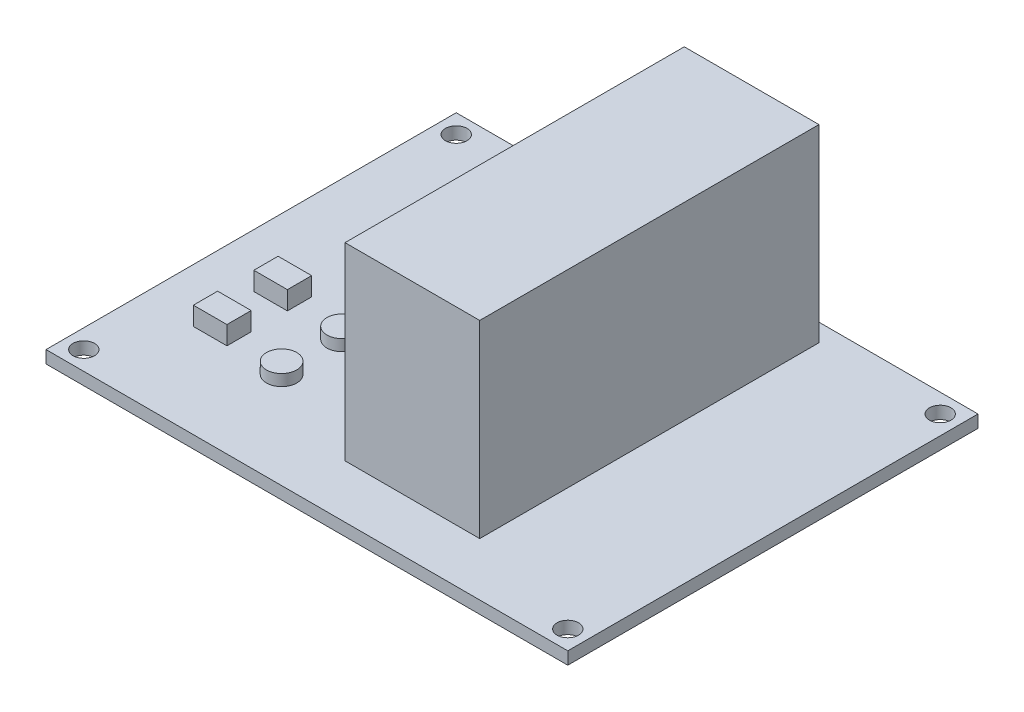
ISO-10303-21;
HEADER;
FILE_DESCRIPTION(('STEP AP214'),'2;1');
FILE_NAME('part.step','',(''),(''),'','','');
FILE_SCHEMA(('AUTOMOTIVE_DESIGN { 1 0 10303 214 1 1 1 1 }'));
ENDSEC;
DATA;
#1=APPLICATION_CONTEXT('core data for automotive mechanical design processes');
#2=APPLICATION_PROTOCOL_DEFINITION('international standard','automotive_design',2000,#1);
#3=PRODUCT_CONTEXT('',#1,'mechanical');
#4=PRODUCT('Part','Part','',(#3));
#5=PRODUCT_RELATED_PRODUCT_CATEGORY('part','',(#4));
#6=PRODUCT_DEFINITION_FORMATION('','',#4);
#7=PRODUCT_DEFINITION_CONTEXT('part definition',#1,'design');
#8=PRODUCT_DEFINITION('design','',#6,#7);
#9=PRODUCT_DEFINITION_SHAPE('','',#8);
#10=(LENGTH_UNIT() NAMED_UNIT(*) SI_UNIT(.MILLI.,.METRE.));
#11=(NAMED_UNIT(*) PLANE_ANGLE_UNIT() SI_UNIT($,.RADIAN.));
#12=(NAMED_UNIT(*) SI_UNIT($,.STERADIAN.) SOLID_ANGLE_UNIT());
#13=UNCERTAINTY_MEASURE_WITH_UNIT(LENGTH_MEASURE(1.E-05),#10,'distance_accuracy_value','');
#14=(GEOMETRIC_REPRESENTATION_CONTEXT(3) GLOBAL_UNCERTAINTY_ASSIGNED_CONTEXT((#13)) GLOBAL_UNIT_ASSIGNED_CONTEXT((#10,
#11,#12)) REPRESENTATION_CONTEXT('',''));
#15=CARTESIAN_POINT('',(0.,0.,0.));
#16=DIRECTION('',(0.,0.,1.));
#17=DIRECTION('',(1.,0.,0.));
#18=AXIS2_PLACEMENT_3D('',#15,#16,#17);
#19=CARTESIAN_POINT('',(0.,1.65,0.));
#20=DIRECTION('',(0.,-1.,0.));
#21=DIRECTION('',(0.,0.,-1.));
#22=AXIS2_PLACEMENT_3D('',#19,#20,#21);
#23=PLANE('',#22);
#24=CARTESIAN_POINT('',(-32.015,1.65,-24.635));
#25=DIRECTION('',(0.,1.,0.));
#26=DIRECTION('',(0.,0.,1.));
#27=AXIS2_PLACEMENT_3D('',#24,#25,#26);
#28=CIRCLE('',#27,1.42239999999999);
#29=CARTESIAN_POINT('',(-32.015,1.65,-23.2126));
#30=VERTEX_POINT('',#29);
#31=EDGE_CURVE('E319',#30,#30,#28,.T.);
#32=ORIENTED_EDGE('',*,*,#31,.F.);
#33=EDGE_LOOP('',(#32));
#34=FACE_BOUND('',#33,.T.);
#35=CARTESIAN_POINT('',(-32.015,1.65,24.635));
#36=DIRECTION('',(0.,1.,0.));
#37=DIRECTION('',(0.,0.,1.));
#38=AXIS2_PLACEMENT_3D('',#35,#36,#37);
#39=CIRCLE('',#38,1.42239999999999);
#40=CARTESIAN_POINT('',(-32.015,1.65,26.0574));
#41=VERTEX_POINT('',#40);
#42=EDGE_CURVE('E313',#41,#41,#39,.T.);
#43=ORIENTED_EDGE('',*,*,#42,.F.);
#44=EDGE_LOOP('',(#43));
#45=FACE_BOUND('',#44,.T.);
#46=CARTESIAN_POINT('',(32.015,1.65,24.635));
#47=DIRECTION('',(0.,1.,0.));
#48=DIRECTION('',(0.,0.,1.));
#49=AXIS2_PLACEMENT_3D('',#46,#47,#48);
#50=CIRCLE('',#49,1.42239999999999);
#51=CARTESIAN_POINT('',(32.015,1.65,26.0574));
#52=VERTEX_POINT('',#51);
#53=EDGE_CURVE('E307',#52,#52,#50,.T.);
#54=ORIENTED_EDGE('',*,*,#53,.F.);
#55=EDGE_LOOP('',(#54));
#56=FACE_BOUND('',#55,.T.);
#57=CARTESIAN_POINT('',(32.015,1.65,-24.635));
#58=DIRECTION('',(0.,1.,0.));
#59=DIRECTION('',(0.,0.,1.));
#60=AXIS2_PLACEMENT_3D('',#57,#58,#59);
#61=CIRCLE('',#60,1.42239999999999);
#62=CARTESIAN_POINT('',(32.015,1.65,-23.2126));
#63=VERTEX_POINT('',#62);
#64=EDGE_CURVE('E301',#63,#63,#61,.T.);
#65=ORIENTED_EDGE('',*,*,#64,.F.);
#66=EDGE_LOOP('',(#65));
#67=FACE_BOUND('',#66,.T.);
#68=DIRECTION('',(0.,0.,-1.));
#69=VECTOR('',#68,1.);
#70=CARTESIAN_POINT('',(-22.975,1.65,3.53));
#71=LINE('',#70,#69);
#72=CARTESIAN_POINT('',(-22.975,1.65,6.74));
#73=VERTEX_POINT('',#72);
#74=CARTESIAN_POINT('',(-22.975,1.65,3.53));
#75=VERTEX_POINT('',#74);
#76=EDGE_CURVE('E167',#73,#75,#71,.T.);
#77=ORIENTED_EDGE('',*,*,#76,.F.);
#78=DIRECTION('',(1.,0.,0.));
#79=VECTOR('',#78,1.);
#80=CARTESIAN_POINT('',(-27.415,1.65,6.74));
#81=LINE('',#80,#79);
#82=CARTESIAN_POINT('',(-27.415,1.65,6.74));
#83=VERTEX_POINT('',#82);
#84=EDGE_CURVE('E180',#83,#73,#81,.T.);
#85=ORIENTED_EDGE('',*,*,#84,.F.);
#86=DIRECTION('',(0.,0.,1.));
#87=VECTOR('',#86,1.);
#88=CARTESIAN_POINT('',(-27.415,1.65,3.53));
#89=LINE('',#88,#87);
#90=CARTESIAN_POINT('',(-27.415,1.65,3.53));
#91=VERTEX_POINT('',#90);
#92=EDGE_CURVE('E189',#91,#83,#89,.T.);
#93=ORIENTED_EDGE('',*,*,#92,.F.);
#94=DIRECTION('',(-1.,0.,0.));
#95=VECTOR('',#94,1.);
#96=CARTESIAN_POINT('',(-27.415,1.65,3.53));
#97=LINE('',#96,#95);
#98=EDGE_CURVE('E170',#75,#91,#97,.T.);
#99=ORIENTED_EDGE('',*,*,#98,.F.);
#100=EDGE_LOOP('',(#77,#85,#93,#99));
#101=FACE_BOUND('',#100,.T.);
#102=DIRECTION('',(0.,0.,-1.));
#103=VECTOR('',#102,1.);
#104=CARTESIAN_POINT('',(34.515,1.65,27.135));
#105=LINE('',#104,#103);
#106=CARTESIAN_POINT('',(34.515,1.65,27.135));
#107=VERTEX_POINT('',#106);
#108=CARTESIAN_POINT('',(34.515,1.65,-27.135));
#109=VERTEX_POINT('',#108);
#110=EDGE_CURVE('E245',#107,#109,#105,.T.);
#111=ORIENTED_EDGE('',*,*,#110,.T.);
#112=DIRECTION('',(-1.,0.,0.));
#113=VECTOR('',#112,1.);
#114=CARTESIAN_POINT('',(-34.515,1.65,-27.135));
#115=LINE('',#114,#113);
#116=CARTESIAN_POINT('',(-34.515,1.65,-27.135));
#117=VERTEX_POINT('',#116);
#118=EDGE_CURVE('E248',#109,#117,#115,.T.);
#119=ORIENTED_EDGE('',*,*,#118,.T.);
#120=DIRECTION('',(0.,0.,1.));
#121=VECTOR('',#120,1.);
#122=CARTESIAN_POINT('',(-34.515,1.65,27.135));
#123=LINE('',#122,#121);
#124=CARTESIAN_POINT('',(-34.515,1.65,27.135));
#125=VERTEX_POINT('',#124);
#126=EDGE_CURVE('E251',#117,#125,#123,.T.);
#127=ORIENTED_EDGE('',*,*,#126,.T.);
#128=DIRECTION('',(1.,0.,0.));
#129=VECTOR('',#128,1.);
#130=CARTESIAN_POINT('',(-34.515,1.65,27.135));
#131=LINE('',#130,#129);
#132=EDGE_CURVE('E253',#125,#107,#131,.T.);
#133=ORIENTED_EDGE('',*,*,#132,.T.);
#134=EDGE_LOOP('',(#111,#119,#127,#133));
#135=FACE_BOUND('',#134,.T.);
#136=CARTESIAN_POINT('',(-16.095,1.65,14.385));
#137=DIRECTION('',(0.,-1.,0.));
#138=DIRECTION('',(0.,0.,-1.));
#139=AXIS2_PLACEMENT_3D('',#136,#137,#138);
#140=CIRCLE('',#139,2.);
#141=CARTESIAN_POINT('',(-16.095,1.65,12.385));
#142=VERTEX_POINT('',#141);
#143=EDGE_CURVE('E41',#142,#142,#140,.F.);
#144=ORIENTED_EDGE('',*,*,#143,.F.);
#145=EDGE_LOOP('',(#144));
#146=FACE_BOUND('',#145,.T.);
#147=CARTESIAN_POINT('',(-16.095,1.65,6.385));
#148=DIRECTION('',(0.,-1.,0.));
#149=DIRECTION('',(0.,0.,-1.));
#150=AXIS2_PLACEMENT_3D('',#147,#148,#149);
#151=CIRCLE('',#150,2.);
#152=CARTESIAN_POINT('',(-16.095,1.65,4.385));
#153=VERTEX_POINT('',#152);
#154=EDGE_CURVE('E11',#153,#153,#151,.F.);
#155=ORIENTED_EDGE('',*,*,#154,.F.);
#156=EDGE_LOOP('',(#155));
#157=FACE_BOUND('',#156,.T.);
#158=DIRECTION('',(0.,0.,-1.));
#159=VECTOR('',#158,1.);
#160=CARTESIAN_POINT('',(-22.975,1.65,11.53));
#161=LINE('',#160,#159);
#162=CARTESIAN_POINT('',(-22.975,1.65,14.74));
#163=VERTEX_POINT('',#162);
#164=CARTESIAN_POINT('',(-22.975,1.65,11.53));
#165=VERTEX_POINT('',#164);
#166=EDGE_CURVE('E205',#163,#165,#161,.T.);
#167=ORIENTED_EDGE('',*,*,#166,.F.);
#168=DIRECTION('',(1.,0.,0.));
#169=VECTOR('',#168,1.);
#170=CARTESIAN_POINT('',(-27.415,1.65,14.74));
#171=LINE('',#170,#169);
#172=CARTESIAN_POINT('',(-27.415,1.65,14.74));
#173=VERTEX_POINT('',#172);
#174=EDGE_CURVE('E210',#173,#163,#171,.T.);
#175=ORIENTED_EDGE('',*,*,#174,.F.);
#176=DIRECTION('',(0.,0.,1.));
#177=VECTOR('',#176,1.);
#178=CARTESIAN_POINT('',(-27.415,1.65,11.53));
#179=LINE('',#178,#177);
#180=CARTESIAN_POINT('',(-27.415,1.65,11.53));
#181=VERTEX_POINT('',#180);
#182=EDGE_CURVE('E222',#181,#173,#179,.T.);
#183=ORIENTED_EDGE('',*,*,#182,.F.);
#184=DIRECTION('',(-1.,0.,0.));
#185=VECTOR('',#184,1.);
#186=CARTESIAN_POINT('',(-27.415,1.65,11.53));
#187=LINE('',#186,#185);
#188=EDGE_CURVE('E219',#165,#181,#187,.T.);
#189=ORIENTED_EDGE('',*,*,#188,.F.);
#190=EDGE_LOOP('',(#167,#175,#183,#189));
#191=FACE_BOUND('',#190,.T.);
#192=DIRECTION('',(0.,0.,1.));
#193=VECTOR('',#192,1.);
#194=CARTESIAN_POINT('',(-1.98499999999999,1.65,-24.775));
#195=LINE('',#194,#193);
#196=CARTESIAN_POINT('',(-1.98499999999999,1.65,-24.775));
#197=VERTEX_POINT('',#196);
#198=CARTESIAN_POINT('',(-1.98499999999999,1.65,20.105));
#199=VERTEX_POINT('',#198);
#200=EDGE_CURVE('E166',#197,#199,#195,.T.);
#201=ORIENTED_EDGE('',*,*,#200,.F.);
#202=DIRECTION('',(-1.,0.,0.));
#203=VECTOR('',#202,1.);
#204=CARTESIAN_POINT('',(-1.98499999999999,1.65,-24.775));
#205=LINE('',#204,#203);
#206=CARTESIAN_POINT('',(15.835,1.65,-24.775));
#207=VERTEX_POINT('',#206);
#208=EDGE_CURVE('E163',#207,#197,#205,.T.);
#209=ORIENTED_EDGE('',*,*,#208,.F.);
#210=DIRECTION('',(0.,0.,-1.));
#211=VECTOR('',#210,1.);
#212=CARTESIAN_POINT('',(15.835,1.65,-24.775));
#213=LINE('',#212,#211);
#214=CARTESIAN_POINT('',(15.835,1.65,20.105));
#215=VERTEX_POINT('',#214);
#216=EDGE_CURVE('E53',#215,#207,#213,.T.);
#217=ORIENTED_EDGE('',*,*,#216,.F.);
#218=DIRECTION('',(1.,0.,0.));
#219=VECTOR('',#218,1.);
#220=CARTESIAN_POINT('',(-1.98499999999999,1.65,20.105));
#221=LINE('',#220,#219);
#222=EDGE_CURVE('E48',#199,#215,#221,.T.);
#223=ORIENTED_EDGE('',*,*,#222,.F.);
#224=EDGE_LOOP('',(#201,#209,#217,#223));
#225=FACE_BOUND('',#224,.T.);
#226=ADVANCED_FACE('F33',(#34,#45,#56,#67,#101,#135,#146,#157,#191,#225),#23,.F.);
#227=CARTESIAN_POINT('',(34.515,1.65,27.135));
#228=DIRECTION('',(-1.,0.,0.));
#229=DIRECTION('',(0.,0.,1.));
#230=AXIS2_PLACEMENT_3D('',#227,#228,#229);
#231=PLANE('',#230);
#232=DIRECTION('',(0.,0.,-1.));
#233=VECTOR('',#232,1.);
#234=CARTESIAN_POINT('',(34.515,0.,27.135));
#235=LINE('',#234,#233);
#236=CARTESIAN_POINT('',(34.515,0.,27.135));
#237=VERTEX_POINT('',#236);
#238=CARTESIAN_POINT('',(34.515,0.,-27.135));
#239=VERTEX_POINT('',#238);
#240=EDGE_CURVE('E244',#237,#239,#235,.T.);
#241=ORIENTED_EDGE('',*,*,#240,.T.);
#242=DIRECTION('',(0.,-1.,0.));
#243=VECTOR('',#242,1.);
#244=CARTESIAN_POINT('',(34.515,1.65,-27.135));
#245=LINE('',#244,#243);
#246=EDGE_CURVE('E271',#109,#239,#245,.T.);
#247=ORIENTED_EDGE('',*,*,#246,.F.);
#248=ORIENTED_EDGE('',*,*,#110,.F.);
#249=DIRECTION('',(0.,-1.,0.));
#250=VECTOR('',#249,1.);
#251=CARTESIAN_POINT('',(34.515,1.65,27.135));
#252=LINE('',#251,#250);
#253=EDGE_CURVE('E255',#107,#237,#252,.T.);
#254=ORIENTED_EDGE('',*,*,#253,.T.);
#255=EDGE_LOOP('',(#241,#247,#248,#254));
#256=FACE_BOUND('',#255,.T.);
#257=ADVANCED_FACE('F35',(#256),#231,.F.);
#258=CARTESIAN_POINT('',(-34.515,1.65,-27.135));
#259=DIRECTION('',(0.,0.,1.));
#260=DIRECTION('',(1.,0.,0.));
#261=AXIS2_PLACEMENT_3D('',#258,#259,#260);
#262=PLANE('',#261);
#263=DIRECTION('',(-1.,0.,0.));
#264=VECTOR('',#263,1.);
#265=CARTESIAN_POINT('',(-34.515,0.,-27.135));
#266=LINE('',#265,#264);
#267=CARTESIAN_POINT('',(-34.515,0.,-27.135));
#268=VERTEX_POINT('',#267);
#269=EDGE_CURVE('E258',#239,#268,#266,.T.);
#270=ORIENTED_EDGE('',*,*,#269,.T.);
#271=DIRECTION('',(0.,-1.,0.));
#272=VECTOR('',#271,1.);
#273=CARTESIAN_POINT('',(-34.515,1.65,-27.135));
#274=LINE('',#273,#272);
#275=EDGE_CURVE('E268',#117,#268,#274,.T.);
#276=ORIENTED_EDGE('',*,*,#275,.F.);
#277=ORIENTED_EDGE('',*,*,#118,.F.);
#278=ORIENTED_EDGE('',*,*,#246,.T.);
#279=EDGE_LOOP('',(#270,#276,#277,#278));
#280=FACE_BOUND('',#279,.T.);
#281=ADVANCED_FACE('F340',(#280),#262,.F.);
#282=CARTESIAN_POINT('',(-34.515,1.65,27.135));
#283=DIRECTION('',(1.,0.,0.));
#284=DIRECTION('',(0.,0.,-1.));
#285=AXIS2_PLACEMENT_3D('',#282,#283,#284);
#286=PLANE('',#285);
#287=DIRECTION('',(0.,0.,1.));
#288=VECTOR('',#287,1.);
#289=CARTESIAN_POINT('',(-34.515,0.,27.135));
#290=LINE('',#289,#288);
#291=CARTESIAN_POINT('',(-34.515,0.,27.135));
#292=VERTEX_POINT('',#291);
#293=EDGE_CURVE('E260',#268,#292,#290,.T.);
#294=ORIENTED_EDGE('',*,*,#293,.T.);
#295=DIRECTION('',(0.,-1.,0.));
#296=VECTOR('',#295,1.);
#297=CARTESIAN_POINT('',(-34.515,1.65,27.135));
#298=LINE('',#297,#296);
#299=EDGE_CURVE('E265',#125,#292,#298,.T.);
#300=ORIENTED_EDGE('',*,*,#299,.F.);
#301=ORIENTED_EDGE('',*,*,#126,.F.);
#302=ORIENTED_EDGE('',*,*,#275,.T.);
#303=EDGE_LOOP('',(#294,#300,#301,#302));
#304=FACE_BOUND('',#303,.T.);
#305=ADVANCED_FACE('F345',(#304),#286,.F.);
#306=CARTESIAN_POINT('',(-34.515,1.65,27.135));
#307=DIRECTION('',(0.,0.,-1.));
#308=DIRECTION('',(-1.,0.,0.));
#309=AXIS2_PLACEMENT_3D('',#306,#307,#308);
#310=PLANE('',#309);
#311=DIRECTION('',(1.,0.,0.));
#312=VECTOR('',#311,1.);
#313=CARTESIAN_POINT('',(-34.515,0.,27.135));
#314=LINE('',#313,#312);
#315=EDGE_CURVE('E249',#292,#237,#314,.T.);
#316=ORIENTED_EDGE('',*,*,#315,.T.);
#317=ORIENTED_EDGE('',*,*,#253,.F.);
#318=ORIENTED_EDGE('',*,*,#132,.F.);
#319=ORIENTED_EDGE('',*,*,#299,.T.);
#320=EDGE_LOOP('',(#316,#317,#318,#319));
#321=FACE_BOUND('',#320,.T.);
#322=ADVANCED_FACE('F348',(#321),#310,.F.);
#323=CARTESIAN_POINT('',(0.,0.,0.));
#324=DIRECTION('',(0.,-1.,0.));
#325=DIRECTION('',(0.,0.,-1.));
#326=AXIS2_PLACEMENT_3D('',#323,#324,#325);
#327=PLANE('',#326);
#328=CARTESIAN_POINT('',(-32.015,0.,-24.635));
#329=DIRECTION('',(0.,1.,0.));
#330=DIRECTION('',(0.,0.,1.));
#331=AXIS2_PLACEMENT_3D('',#328,#329,#330);
#332=CIRCLE('',#331,1.42239999999999);
#333=CARTESIAN_POINT('',(-32.015,0.,-23.2126));
#334=VERTEX_POINT('',#333);
#335=EDGE_CURVE('E316',#334,#334,#332,.T.);
#336=ORIENTED_EDGE('',*,*,#335,.T.);
#337=EDGE_LOOP('',(#336));
#338=FACE_BOUND('',#337,.T.);
#339=CARTESIAN_POINT('',(-32.015,0.,24.635));
#340=DIRECTION('',(0.,1.,0.));
#341=DIRECTION('',(0.,0.,1.));
#342=AXIS2_PLACEMENT_3D('',#339,#340,#341);
#343=CIRCLE('',#342,1.42239999999999);
#344=CARTESIAN_POINT('',(-32.015,0.,26.0574));
#345=VERTEX_POINT('',#344);
#346=EDGE_CURVE('E310',#345,#345,#343,.T.);
#347=ORIENTED_EDGE('',*,*,#346,.T.);
#348=EDGE_LOOP('',(#347));
#349=FACE_BOUND('',#348,.T.);
#350=CARTESIAN_POINT('',(32.015,0.,24.635));
#351=DIRECTION('',(0.,1.,0.));
#352=DIRECTION('',(0.,0.,1.));
#353=AXIS2_PLACEMENT_3D('',#350,#351,#352);
#354=CIRCLE('',#353,1.42239999999999);
#355=CARTESIAN_POINT('',(32.015,0.,26.0574));
#356=VERTEX_POINT('',#355);
#357=EDGE_CURVE('E304',#356,#356,#354,.T.);
#358=ORIENTED_EDGE('',*,*,#357,.T.);
#359=EDGE_LOOP('',(#358));
#360=FACE_BOUND('',#359,.T.);
#361=CARTESIAN_POINT('',(32.015,0.,-24.635));
#362=DIRECTION('',(0.,1.,0.));
#363=DIRECTION('',(0.,0.,1.));
#364=AXIS2_PLACEMENT_3D('',#361,#362,#363);
#365=CIRCLE('',#364,1.42239999999999);
#366=CARTESIAN_POINT('',(32.015,0.,-23.2126));
#367=VERTEX_POINT('',#366);
#368=EDGE_CURVE('E285',#367,#367,#365,.T.);
#369=ORIENTED_EDGE('',*,*,#368,.T.);
#370=EDGE_LOOP('',(#369));
#371=FACE_BOUND('',#370,.T.);
#372=ORIENTED_EDGE('',*,*,#240,.F.);
#373=ORIENTED_EDGE('',*,*,#315,.F.);
#374=ORIENTED_EDGE('',*,*,#293,.F.);
#375=ORIENTED_EDGE('',*,*,#269,.F.);
#376=EDGE_LOOP('',(#372,#373,#374,#375));
#377=FACE_BOUND('',#376,.T.);
#378=ADVANCED_FACE('F350',(#338,#349,#360,#371,#377),#327,.T.);
#379=CARTESIAN_POINT('',(-16.095,3.15,14.385));
#380=DIRECTION('',(0.,-1.,0.));
#381=DIRECTION('',(0.,0.,-1.));
#382=AXIS2_PLACEMENT_3D('',#379,#380,#381);
#383=CYLINDRICAL_SURFACE('',#382,2.);
#384=CARTESIAN_POINT('',(-16.095,3.15,14.385));
#385=DIRECTION('',(0.,1.,0.));
#386=DIRECTION('',(0.,0.,1.));
#387=AXIS2_PLACEMENT_3D('',#384,#385,#386);
#388=CIRCLE('',#387,2.);
#389=CARTESIAN_POINT('',(-16.095,3.15,16.385));
#390=VERTEX_POINT('',#389);
#391=EDGE_CURVE('E241',#390,#390,#388,.T.);
#392=ORIENTED_EDGE('',*,*,#391,.F.);
#393=EDGE_LOOP('',(#392));
#394=FACE_BOUND('',#393,.T.);
#395=ORIENTED_EDGE('',*,*,#143,.T.);
#396=EDGE_LOOP('',(#395));
#397=FACE_BOUND('',#396,.T.);
#398=ADVANCED_FACE('F276',(#394,#397),#383,.T.);
#399=CARTESIAN_POINT('',(-16.095,3.15,14.385));
#400=DIRECTION('',(0.,1.,0.));
#401=DIRECTION('',(0.,0.,1.));
#402=AXIS2_PLACEMENT_3D('',#399,#400,#401);
#403=PLANE('',#402);
#404=ORIENTED_EDGE('',*,*,#391,.T.);
#405=EDGE_LOOP('',(#404));
#406=FACE_BOUND('',#405,.T.);
#407=ADVANCED_FACE('F358',(#406),#403,.T.);
#408=CARTESIAN_POINT('',(-16.095,3.15,6.385));
#409=DIRECTION('',(0.,-1.,0.));
#410=DIRECTION('',(0.,0.,-1.));
#411=AXIS2_PLACEMENT_3D('',#408,#409,#410);
#412=CYLINDRICAL_SURFACE('',#411,2.);
#413=CARTESIAN_POINT('',(-16.095,3.15,6.385));
#414=DIRECTION('',(0.,1.,0.));
#415=DIRECTION('',(0.,0.,1.));
#416=AXIS2_PLACEMENT_3D('',#413,#414,#415);
#417=CIRCLE('',#416,2.);
#418=CARTESIAN_POINT('',(-16.095,3.15,8.385));
#419=VERTEX_POINT('',#418);
#420=EDGE_CURVE('E238',#419,#419,#417,.T.);
#421=ORIENTED_EDGE('',*,*,#420,.F.);
#422=EDGE_LOOP('',(#421));
#423=FACE_BOUND('',#422,.T.);
#424=ORIENTED_EDGE('',*,*,#154,.T.);
#425=EDGE_LOOP('',(#424));
#426=FACE_BOUND('',#425,.T.);
#427=ADVANCED_FACE('F404',(#423,#426),#412,.T.);
#428=CARTESIAN_POINT('',(-16.095,3.15,6.385));
#429=DIRECTION('',(0.,1.,0.));
#430=DIRECTION('',(0.,0.,1.));
#431=AXIS2_PLACEMENT_3D('',#428,#429,#430);
#432=PLANE('',#431);
#433=ORIENTED_EDGE('',*,*,#420,.T.);
#434=EDGE_LOOP('',(#433));
#435=FACE_BOUND('',#434,.T.);
#436=ADVANCED_FACE('F414',(#435),#432,.T.);
#437=CARTESIAN_POINT('',(-22.975,4.09,11.53));
#438=DIRECTION('',(-1.,0.,0.));
#439=DIRECTION('',(0.,0.,1.));
#440=AXIS2_PLACEMENT_3D('',#437,#438,#439);
#441=PLANE('',#440);
#442=ORIENTED_EDGE('',*,*,#166,.T.);
#443=DIRECTION('',(0.,-1.,0.));
#444=VECTOR('',#443,1.);
#445=CARTESIAN_POINT('',(-22.975,4.09,11.53));
#446=LINE('',#445,#444);
#447=CARTESIAN_POINT('',(-22.975,4.09,11.53));
#448=VERTEX_POINT('',#447);
#449=EDGE_CURVE('E235',#448,#165,#446,.T.);
#450=ORIENTED_EDGE('',*,*,#449,.F.);
#451=DIRECTION('',(0.,0.,-1.));
#452=VECTOR('',#451,1.);
#453=CARTESIAN_POINT('',(-22.975,4.09,11.53));
#454=LINE('',#453,#452);
#455=CARTESIAN_POINT('',(-22.975,4.09,14.74));
#456=VERTEX_POINT('',#455);
#457=EDGE_CURVE('E206',#456,#448,#454,.T.);
#458=ORIENTED_EDGE('',*,*,#457,.F.);
#459=DIRECTION('',(0.,-1.,0.));
#460=VECTOR('',#459,1.);
#461=CARTESIAN_POINT('',(-22.975,4.09,14.74));
#462=LINE('',#461,#460);
#463=EDGE_CURVE('E216',#456,#163,#462,.T.);
#464=ORIENTED_EDGE('',*,*,#463,.T.);
#465=EDGE_LOOP('',(#442,#450,#458,#464));
#466=FACE_BOUND('',#465,.T.);
#467=ADVANCED_FACE('F424',(#466),#441,.F.);
#468=CARTESIAN_POINT('',(-27.415,4.09,11.53));
#469=DIRECTION('',(0.,0.,1.));
#470=DIRECTION('',(1.,0.,0.));
#471=AXIS2_PLACEMENT_3D('',#468,#469,#470);
#472=PLANE('',#471);
#473=ORIENTED_EDGE('',*,*,#188,.T.);
#474=DIRECTION('',(0.,-1.,0.));
#475=VECTOR('',#474,1.);
#476=CARTESIAN_POINT('',(-27.415,4.09,11.53));
#477=LINE('',#476,#475);
#478=CARTESIAN_POINT('',(-27.415,4.09,11.53));
#479=VERTEX_POINT('',#478);
#480=EDGE_CURVE('E232',#479,#181,#477,.T.);
#481=ORIENTED_EDGE('',*,*,#480,.F.);
#482=DIRECTION('',(-1.,0.,0.));
#483=VECTOR('',#482,1.);
#484=CARTESIAN_POINT('',(-27.415,4.09,11.53));
#485=LINE('',#484,#483);
#486=EDGE_CURVE('E209',#448,#479,#485,.T.);
#487=ORIENTED_EDGE('',*,*,#486,.F.);
#488=ORIENTED_EDGE('',*,*,#449,.T.);
#489=EDGE_LOOP('',(#473,#481,#487,#488));
#490=FACE_BOUND('',#489,.T.);
#491=ADVANCED_FACE('F434',(#490),#472,.F.);
#492=CARTESIAN_POINT('',(-27.415,4.09,11.53));
#493=DIRECTION('',(1.,0.,0.));
#494=DIRECTION('',(0.,0.,-1.));
#495=AXIS2_PLACEMENT_3D('',#492,#493,#494);
#496=PLANE('',#495);
#497=ORIENTED_EDGE('',*,*,#182,.T.);
#498=DIRECTION('',(0.,-1.,0.));
#499=VECTOR('',#498,1.);
#500=CARTESIAN_POINT('',(-27.415,4.09,14.74));
#501=LINE('',#500,#499);
#502=CARTESIAN_POINT('',(-27.415,4.09,14.74));
#503=VERTEX_POINT('',#502);
#504=EDGE_CURVE('E229',#503,#173,#501,.T.);
#505=ORIENTED_EDGE('',*,*,#504,.F.);
#506=DIRECTION('',(0.,0.,1.));
#507=VECTOR('',#506,1.);
#508=CARTESIAN_POINT('',(-27.415,4.09,11.53));
#509=LINE('',#508,#507);
#510=EDGE_CURVE('E212',#479,#503,#509,.T.);
#511=ORIENTED_EDGE('',*,*,#510,.F.);
#512=ORIENTED_EDGE('',*,*,#480,.T.);
#513=EDGE_LOOP('',(#497,#505,#511,#512));
#514=FACE_BOUND('',#513,.T.);
#515=ADVANCED_FACE('F444',(#514),#496,.F.);
#516=CARTESIAN_POINT('',(-27.415,4.09,14.74));
#517=DIRECTION('',(0.,0.,-1.));
#518=DIRECTION('',(-1.,0.,0.));
#519=AXIS2_PLACEMENT_3D('',#516,#517,#518);
#520=PLANE('',#519);
#521=ORIENTED_EDGE('',*,*,#174,.T.);
#522=ORIENTED_EDGE('',*,*,#463,.F.);
#523=DIRECTION('',(1.,0.,0.));
#524=VECTOR('',#523,1.);
#525=CARTESIAN_POINT('',(-27.415,4.09,14.74));
#526=LINE('',#525,#524);
#527=EDGE_CURVE('E214',#503,#456,#526,.T.);
#528=ORIENTED_EDGE('',*,*,#527,.F.);
#529=ORIENTED_EDGE('',*,*,#504,.T.);
#530=EDGE_LOOP('',(#521,#522,#528,#529));
#531=FACE_BOUND('',#530,.T.);
#532=ADVANCED_FACE('F454',(#531),#520,.F.);
#533=CARTESIAN_POINT('',(0.,4.09,0.));
#534=DIRECTION('',(0.,1.,0.));
#535=DIRECTION('',(0.,0.,1.));
#536=AXIS2_PLACEMENT_3D('',#533,#534,#535);
#537=PLANE('',#536);
#538=ORIENTED_EDGE('',*,*,#457,.T.);
#539=ORIENTED_EDGE('',*,*,#486,.T.);
#540=ORIENTED_EDGE('',*,*,#510,.T.);
#541=ORIENTED_EDGE('',*,*,#527,.T.);
#542=EDGE_LOOP('',(#538,#539,#540,#541));
#543=FACE_BOUND('',#542,.T.);
#544=ADVANCED_FACE('F464',(#543),#537,.T.);
#545=CARTESIAN_POINT('',(-22.975,4.09,3.53));
#546=DIRECTION('',(-1.,0.,0.));
#547=DIRECTION('',(0.,0.,1.));
#548=AXIS2_PLACEMENT_3D('',#545,#546,#547);
#549=PLANE('',#548);
#550=ORIENTED_EDGE('',*,*,#76,.T.);
#551=DIRECTION('',(0.,-1.,0.));
#552=VECTOR('',#551,1.);
#553=CARTESIAN_POINT('',(-22.975,4.09,3.53));
#554=LINE('',#553,#552);
#555=CARTESIAN_POINT('',(-22.975,4.09,3.53));
#556=VERTEX_POINT('',#555);
#557=EDGE_CURVE('E202',#556,#75,#554,.T.);
#558=ORIENTED_EDGE('',*,*,#557,.F.);
#559=DIRECTION('',(0.,0.,-1.));
#560=VECTOR('',#559,1.);
#561=CARTESIAN_POINT('',(-22.975,4.09,3.53));
#562=LINE('',#561,#560);
#563=CARTESIAN_POINT('',(-22.975,4.09,6.74));
#564=VERTEX_POINT('',#563);
#565=EDGE_CURVE('E176',#564,#556,#562,.T.);
#566=ORIENTED_EDGE('',*,*,#565,.F.);
#567=DIRECTION('',(0.,-1.,0.));
#568=VECTOR('',#567,1.);
#569=CARTESIAN_POINT('',(-22.975,4.09,6.74));
#570=LINE('',#569,#568);
#571=EDGE_CURVE('E185',#564,#73,#570,.T.);
#572=ORIENTED_EDGE('',*,*,#571,.T.);
#573=EDGE_LOOP('',(#550,#558,#566,#572));
#574=FACE_BOUND('',#573,.T.);
#575=ADVANCED_FACE('F474',(#574),#549,.F.);
#576=CARTESIAN_POINT('',(-27.415,4.09,3.53));
#577=DIRECTION('',(0.,0.,1.));
#578=DIRECTION('',(1.,0.,0.));
#579=AXIS2_PLACEMENT_3D('',#576,#577,#578);
#580=PLANE('',#579);
#581=ORIENTED_EDGE('',*,*,#98,.T.);
#582=DIRECTION('',(0.,-1.,0.));
#583=VECTOR('',#582,1.);
#584=CARTESIAN_POINT('',(-27.415,4.09,3.53));
#585=LINE('',#584,#583);
#586=CARTESIAN_POINT('',(-27.415,4.09,3.53));
#587=VERTEX_POINT('',#586);
#588=EDGE_CURVE('E199',#587,#91,#585,.T.);
#589=ORIENTED_EDGE('',*,*,#588,.F.);
#590=DIRECTION('',(-1.,0.,0.));
#591=VECTOR('',#590,1.);
#592=CARTESIAN_POINT('',(-27.415,4.09,3.53));
#593=LINE('',#592,#591);
#594=EDGE_CURVE('E179',#556,#587,#593,.T.);
#595=ORIENTED_EDGE('',*,*,#594,.F.);
#596=ORIENTED_EDGE('',*,*,#557,.T.);
#597=EDGE_LOOP('',(#581,#589,#595,#596));
#598=FACE_BOUND('',#597,.T.);
#599=ADVANCED_FACE('F484',(#598),#580,.F.);
#600=CARTESIAN_POINT('',(-27.415,4.09,3.53));
#601=DIRECTION('',(1.,0.,0.));
#602=DIRECTION('',(0.,0.,-1.));
#603=AXIS2_PLACEMENT_3D('',#600,#601,#602);
#604=PLANE('',#603);
#605=ORIENTED_EDGE('',*,*,#92,.T.);
#606=DIRECTION('',(0.,-1.,0.));
#607=VECTOR('',#606,1.);
#608=CARTESIAN_POINT('',(-27.415,4.09,6.74));
#609=LINE('',#608,#607);
#610=CARTESIAN_POINT('',(-27.415,4.09,6.74));
#611=VERTEX_POINT('',#610);
#612=EDGE_CURVE('E196',#611,#83,#609,.T.);
#613=ORIENTED_EDGE('',*,*,#612,.F.);
#614=DIRECTION('',(0.,0.,1.));
#615=VECTOR('',#614,1.);
#616=CARTESIAN_POINT('',(-27.415,4.09,3.53));
#617=LINE('',#616,#615);
#618=EDGE_CURVE('E182',#587,#611,#617,.T.);
#619=ORIENTED_EDGE('',*,*,#618,.F.);
#620=ORIENTED_EDGE('',*,*,#588,.T.);
#621=EDGE_LOOP('',(#605,#613,#619,#620));
#622=FACE_BOUND('',#621,.T.);
#623=ADVANCED_FACE('F494',(#622),#604,.F.);
#624=CARTESIAN_POINT('',(-27.415,4.09,6.74));
#625=DIRECTION('',(0.,0.,-1.));
#626=DIRECTION('',(-1.,0.,0.));
#627=AXIS2_PLACEMENT_3D('',#624,#625,#626);
#628=PLANE('',#627);
#629=ORIENTED_EDGE('',*,*,#84,.T.);
#630=ORIENTED_EDGE('',*,*,#571,.F.);
#631=DIRECTION('',(1.,0.,0.));
#632=VECTOR('',#631,1.);
#633=CARTESIAN_POINT('',(-27.415,4.09,6.74));
#634=LINE('',#633,#632);
#635=EDGE_CURVE('E184',#611,#564,#634,.T.);
#636=ORIENTED_EDGE('',*,*,#635,.F.);
#637=ORIENTED_EDGE('',*,*,#612,.T.);
#638=EDGE_LOOP('',(#629,#630,#636,#637));
#639=FACE_BOUND('',#638,.T.);
#640=ADVANCED_FACE('F504',(#639),#628,.F.);
#641=CARTESIAN_POINT('',(0.,4.09,0.));
#642=DIRECTION('',(0.,1.,0.));
#643=DIRECTION('',(0.,0.,1.));
#644=AXIS2_PLACEMENT_3D('',#641,#642,#643);
#645=PLANE('',#644);
#646=ORIENTED_EDGE('',*,*,#565,.T.);
#647=ORIENTED_EDGE('',*,*,#594,.T.);
#648=ORIENTED_EDGE('',*,*,#618,.T.);
#649=ORIENTED_EDGE('',*,*,#635,.T.);
#650=EDGE_LOOP('',(#646,#647,#648,#649));
#651=FACE_BOUND('',#650,.T.);
#652=ADVANCED_FACE('F514',(#651),#645,.T.);
#653=CARTESIAN_POINT('',(-1.98499999999999,26.65,-24.775));
#654=DIRECTION('',(1.,0.,0.));
#655=DIRECTION('',(0.,0.,-1.));
#656=AXIS2_PLACEMENT_3D('',#653,#654,#655);
#657=PLANE('',#656);
#658=ORIENTED_EDGE('',*,*,#200,.T.);
#659=DIRECTION('',(0.,-1.,0.));
#660=VECTOR('',#659,1.);
#661=CARTESIAN_POINT('',(-1.98499999999999,26.65,20.105));
#662=LINE('',#661,#660);
#663=CARTESIAN_POINT('',(-1.98499999999999,26.65,20.105));
#664=VERTEX_POINT('',#663);
#665=EDGE_CURVE('E147',#664,#199,#662,.T.);
#666=ORIENTED_EDGE('',*,*,#665,.F.);
#667=DIRECTION('',(0.,0.,1.));
#668=VECTOR('',#667,1.);
#669=CARTESIAN_POINT('',(-1.98499999999999,26.65,-24.775));
#670=LINE('',#669,#668);
#671=CARTESIAN_POINT('',(-1.98499999999999,26.65,-24.775));
#672=VERTEX_POINT('',#671);
#673=EDGE_CURVE('E154',#672,#664,#670,.T.);
#674=ORIENTED_EDGE('',*,*,#673,.F.);
#675=DIRECTION('',(0.,-1.,0.));
#676=VECTOR('',#675,1.);
#677=CARTESIAN_POINT('',(-1.98499999999999,26.65,-24.775));
#678=LINE('',#677,#676);
#679=EDGE_CURVE('E290',#672,#197,#678,.T.);
#680=ORIENTED_EDGE('',*,*,#679,.T.);
#681=EDGE_LOOP('',(#658,#666,#674,#680));
#682=FACE_BOUND('',#681,.T.);
#683=ADVANCED_FACE('F165',(#682),#657,.F.);
#684=CARTESIAN_POINT('',(-1.98499999999999,26.65,20.105));
#685=DIRECTION('',(0.,0.,-1.));
#686=DIRECTION('',(-1.,0.,0.));
#687=AXIS2_PLACEMENT_3D('',#684,#685,#686);
#688=PLANE('',#687);
#689=ORIENTED_EDGE('',*,*,#222,.T.);
#690=DIRECTION('',(0.,-1.,0.));
#691=VECTOR('',#690,1.);
#692=CARTESIAN_POINT('',(15.835,26.65,20.105));
#693=LINE('',#692,#691);
#694=CARTESIAN_POINT('',(15.835,26.65,20.105));
#695=VERTEX_POINT('',#694);
#696=EDGE_CURVE('E150',#695,#215,#693,.T.);
#697=ORIENTED_EDGE('',*,*,#696,.F.);
#698=DIRECTION('',(1.,0.,0.));
#699=VECTOR('',#698,1.);
#700=CARTESIAN_POINT('',(-1.98499999999999,26.65,20.105));
#701=LINE('',#700,#699);
#702=EDGE_CURVE('E143',#664,#695,#701,.T.);
#703=ORIENTED_EDGE('',*,*,#702,.F.);
#704=ORIENTED_EDGE('',*,*,#665,.T.);
#705=EDGE_LOOP('',(#689,#697,#703,#704));
#706=FACE_BOUND('',#705,.T.);
#707=ADVANCED_FACE('F145',(#706),#688,.F.);
#708=CARTESIAN_POINT('',(15.835,26.65,-24.775));
#709=DIRECTION('',(-1.,0.,0.));
#710=DIRECTION('',(0.,0.,1.));
#711=AXIS2_PLACEMENT_3D('',#708,#709,#710);
#712=PLANE('',#711);
#713=ORIENTED_EDGE('',*,*,#216,.T.);
#714=DIRECTION('',(0.,-1.,0.));
#715=VECTOR('',#714,1.);
#716=CARTESIAN_POINT('',(15.835,26.65,-24.775));
#717=LINE('',#716,#715);
#718=CARTESIAN_POINT('',(15.835,26.65,-24.775));
#719=VERTEX_POINT('',#718);
#720=EDGE_CURVE('E172',#719,#207,#717,.T.);
#721=ORIENTED_EDGE('',*,*,#720,.F.);
#722=DIRECTION('',(0.,0.,-1.));
#723=VECTOR('',#722,1.);
#724=CARTESIAN_POINT('',(15.835,26.65,-24.775));
#725=LINE('',#724,#723);
#726=EDGE_CURVE('E153',#695,#719,#725,.T.);
#727=ORIENTED_EDGE('',*,*,#726,.F.);
#728=ORIENTED_EDGE('',*,*,#696,.T.);
#729=EDGE_LOOP('',(#713,#721,#727,#728));
#730=FACE_BOUND('',#729,.T.);
#731=ADVANCED_FACE('F543',(#730),#712,.F.);
#732=CARTESIAN_POINT('',(-1.98499999999999,26.65,-24.775));
#733=DIRECTION('',(0.,0.,1.));
#734=DIRECTION('',(1.,0.,0.));
#735=AXIS2_PLACEMENT_3D('',#732,#733,#734);
#736=PLANE('',#735);
#737=ORIENTED_EDGE('',*,*,#208,.T.);
#738=ORIENTED_EDGE('',*,*,#679,.F.);
#739=DIRECTION('',(-1.,0.,0.));
#740=VECTOR('',#739,1.);
#741=CARTESIAN_POINT('',(-1.98499999999999,26.65,-24.775));
#742=LINE('',#741,#740);
#743=EDGE_CURVE('E159',#719,#672,#742,.T.);
#744=ORIENTED_EDGE('',*,*,#743,.F.);
#745=ORIENTED_EDGE('',*,*,#720,.T.);
#746=EDGE_LOOP('',(#737,#738,#744,#745));
#747=FACE_BOUND('',#746,.T.);
#748=ADVANCED_FACE('F289',(#747),#736,.F.);
#749=CARTESIAN_POINT('',(0.,26.65,0.));
#750=DIRECTION('',(0.,1.,0.));
#751=DIRECTION('',(0.,0.,1.));
#752=AXIS2_PLACEMENT_3D('',#749,#750,#751);
#753=PLANE('',#752);
#754=ORIENTED_EDGE('',*,*,#673,.T.);
#755=ORIENTED_EDGE('',*,*,#702,.T.);
#756=ORIENTED_EDGE('',*,*,#726,.T.);
#757=ORIENTED_EDGE('',*,*,#743,.T.);
#758=EDGE_LOOP('',(#754,#755,#756,#757));
#759=FACE_BOUND('',#758,.T.);
#760=ADVANCED_FACE('F157',(#759),#753,.T.);
#761=CARTESIAN_POINT('',(32.015,1.65,-24.635));
#762=DIRECTION('',(0.,1.,0.));
#763=DIRECTION('',(0.,0.,1.));
#764=AXIS2_PLACEMENT_3D('',#761,#762,#763);
#765=CYLINDRICAL_SURFACE('',#764,1.42239999999999);
#766=ORIENTED_EDGE('',*,*,#368,.F.);
#767=EDGE_LOOP('',(#766));
#768=FACE_BOUND('',#767,.T.);
#769=ORIENTED_EDGE('',*,*,#64,.T.);
#770=EDGE_LOOP('',(#769));
#771=FACE_BOUND('',#770,.T.);
#772=ADVANCED_FACE('F568',(#768,#771),#765,.F.);
#773=CARTESIAN_POINT('',(32.015,1.65,24.635));
#774=DIRECTION('',(0.,1.,0.));
#775=DIRECTION('',(0.,0.,1.));
#776=AXIS2_PLACEMENT_3D('',#773,#774,#775);
#777=CYLINDRICAL_SURFACE('',#776,1.42239999999999);
#778=ORIENTED_EDGE('',*,*,#357,.F.);
#779=EDGE_LOOP('',(#778));
#780=FACE_BOUND('',#779,.T.);
#781=ORIENTED_EDGE('',*,*,#53,.T.);
#782=EDGE_LOOP('',(#781));
#783=FACE_BOUND('',#782,.T.);
#784=ADVANCED_FACE('F581',(#780,#783),#777,.F.);
#785=CARTESIAN_POINT('',(-32.015,1.65,24.635));
#786=DIRECTION('',(0.,1.,0.));
#787=DIRECTION('',(0.,0.,1.));
#788=AXIS2_PLACEMENT_3D('',#785,#786,#787);
#789=CYLINDRICAL_SURFACE('',#788,1.42239999999999);
#790=ORIENTED_EDGE('',*,*,#346,.F.);
#791=EDGE_LOOP('',(#790));
#792=FACE_BOUND('',#791,.T.);
#793=ORIENTED_EDGE('',*,*,#42,.T.);
#794=EDGE_LOOP('',(#793));
#795=FACE_BOUND('',#794,.T.);
#796=ADVANCED_FACE('F588',(#792,#795),#789,.F.);
#797=CARTESIAN_POINT('',(-32.015,1.65,-24.635));
#798=DIRECTION('',(0.,1.,0.));
#799=DIRECTION('',(0.,0.,1.));
#800=AXIS2_PLACEMENT_3D('',#797,#798,#799);
#801=CYLINDRICAL_SURFACE('',#800,1.42239999999999);
#802=ORIENTED_EDGE('',*,*,#335,.F.);
#803=EDGE_LOOP('',(#802));
#804=FACE_BOUND('',#803,.T.);
#805=ORIENTED_EDGE('',*,*,#31,.T.);
#806=EDGE_LOOP('',(#805));
#807=FACE_BOUND('',#806,.T.);
#808=ADVANCED_FACE('F323',(#804,#807),#801,.F.);
#809=CLOSED_SHELL('',(#226,#257,#281,#305,#322,#378,#398,#407,#427,#436,#467,#491,#515,#532,
#544,#575,#599,#623,#640,#652,#683,#707,#731,#748,#760,#772,#784,#796,#808));
#810=MANIFOLD_SOLID_BREP('B2',#809);
#811=ADVANCED_BREP_SHAPE_REPRESENTATION('',(#18,#810),#14);
#812=SHAPE_DEFINITION_REPRESENTATION(#9,#811);
ENDSEC;
END-ISO-10303-21;
